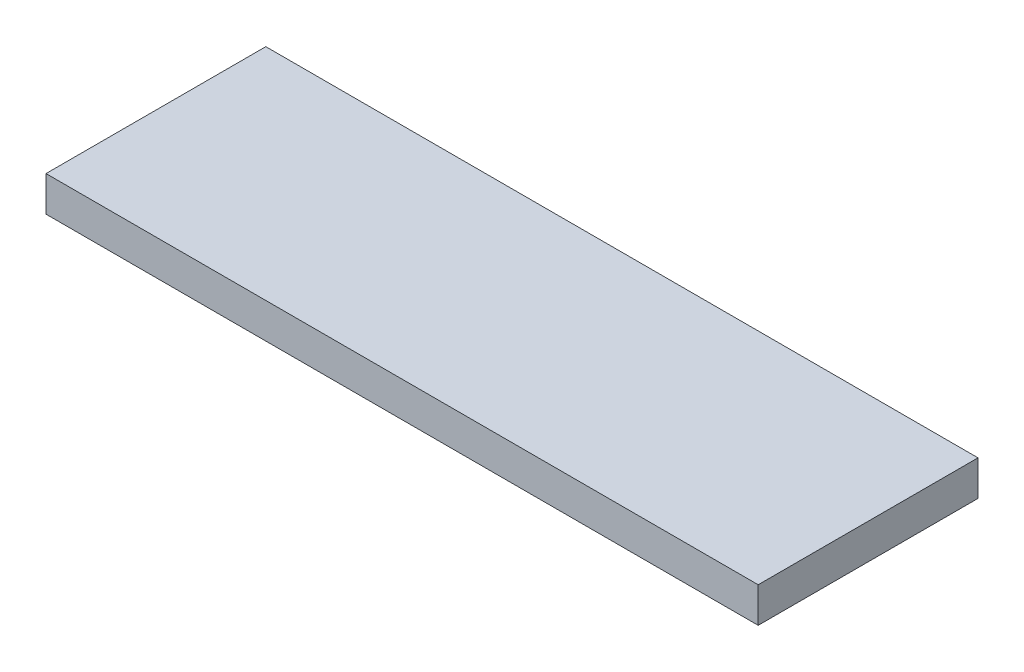
ISO-10303-21;
HEADER;
FILE_DESCRIPTION(('STEP AP214'),'2;1');
FILE_NAME('part.step','',(''),(''),'','','');
FILE_SCHEMA(('AUTOMOTIVE_DESIGN { 1 0 10303 214 1 1 1 1 }'));
ENDSEC;
DATA;
#1=APPLICATION_CONTEXT('core data for automotive mechanical design processes');
#2=APPLICATION_PROTOCOL_DEFINITION('international standard','automotive_design',2000,#1);
#3=PRODUCT_CONTEXT('',#1,'mechanical');
#4=PRODUCT('Part','Part','',(#3));
#5=PRODUCT_RELATED_PRODUCT_CATEGORY('part','',(#4));
#6=PRODUCT_DEFINITION_FORMATION('','',#4);
#7=PRODUCT_DEFINITION_CONTEXT('part definition',#1,'design');
#8=PRODUCT_DEFINITION('design','',#6,#7);
#9=PRODUCT_DEFINITION_SHAPE('','',#8);
#10=(LENGTH_UNIT() NAMED_UNIT(*) SI_UNIT(.MILLI.,.METRE.));
#11=(NAMED_UNIT(*) PLANE_ANGLE_UNIT() SI_UNIT($,.RADIAN.));
#12=(NAMED_UNIT(*) SI_UNIT($,.STERADIAN.) SOLID_ANGLE_UNIT());
#13=UNCERTAINTY_MEASURE_WITH_UNIT(LENGTH_MEASURE(1.E-05),#10,'distance_accuracy_value','');
#14=(GEOMETRIC_REPRESENTATION_CONTEXT(3) GLOBAL_UNCERTAINTY_ASSIGNED_CONTEXT((#13)) GLOBAL_UNIT_ASSIGNED_CONTEXT((#10,
#11,#12)) REPRESENTATION_CONTEXT('',''));
#15=CARTESIAN_POINT('',(0.,0.,0.));
#16=DIRECTION('',(0.,0.,1.));
#17=DIRECTION('',(1.,0.,0.));
#18=AXIS2_PLACEMENT_3D('',#15,#16,#17);
#19=CARTESIAN_POINT('',(0.,4.,25.));
#20=DIRECTION('',(1.,0.,0.));
#21=DIRECTION('',(0.,0.,-1.));
#22=AXIS2_PLACEMENT_3D('',#19,#20,#21);
#23=PLANE('',#22);
#24=DIRECTION('',(0.,-1.,0.));
#25=VECTOR('',#24,1.);
#26=CARTESIAN_POINT('',(0.,4.,0.));
#27=LINE('',#26,#25);
#28=CARTESIAN_POINT('',(0.,4.,0.));
#29=VERTEX_POINT('',#28);
#30=CARTESIAN_POINT('',(0.,0.,0.));
#31=VERTEX_POINT('',#30);
#32=EDGE_CURVE('E102',#29,#31,#27,.T.);
#33=ORIENTED_EDGE('',*,*,#32,.T.);
#34=DIRECTION('',(0.,0.,-1.));
#35=VECTOR('',#34,1.);
#36=CARTESIAN_POINT('',(0.,0.,25.));
#37=LINE('',#36,#35);
#38=CARTESIAN_POINT('',(0.,0.,25.));
#39=VERTEX_POINT('',#38);
#40=EDGE_CURVE('E11',#39,#31,#37,.T.);
#41=ORIENTED_EDGE('',*,*,#40,.F.);
#42=DIRECTION('',(0.,-1.,0.));
#43=VECTOR('',#42,1.);
#44=CARTESIAN_POINT('',(0.,4.,25.));
#45=LINE('',#44,#43);
#46=CARTESIAN_POINT('',(0.,4.,25.));
#47=VERTEX_POINT('',#46);
#48=EDGE_CURVE('E90',#47,#39,#45,.T.);
#49=ORIENTED_EDGE('',*,*,#48,.F.);
#50=DIRECTION('',(0.,0.,-1.));
#51=VECTOR('',#50,1.);
#52=CARTESIAN_POINT('',(0.,4.,25.));
#53=LINE('',#52,#51);
#54=EDGE_CURVE('E98',#47,#29,#53,.T.);
#55=ORIENTED_EDGE('',*,*,#54,.T.);
#56=EDGE_LOOP('',(#33,#41,#49,#55));
#57=FACE_BOUND('',#56,.T.);
#58=ADVANCED_FACE('F39',(#57),#23,.F.);
#59=CARTESIAN_POINT('',(0.,0.,25.));
#60=DIRECTION('',(0.,1.,0.));
#61=DIRECTION('',(0.,0.,1.));
#62=AXIS2_PLACEMENT_3D('',#59,#60,#61);
#63=PLANE('',#62);
#64=DIRECTION('',(1.,0.,0.));
#65=VECTOR('',#64,1.);
#66=CARTESIAN_POINT('',(0.,0.,0.));
#67=LINE('',#66,#65);
#68=CARTESIAN_POINT('',(81.,0.,0.));
#69=VERTEX_POINT('',#68);
#70=EDGE_CURVE('E94',#31,#69,#67,.T.);
#71=ORIENTED_EDGE('',*,*,#70,.T.);
#72=DIRECTION('',(0.,0.,-1.));
#73=VECTOR('',#72,1.);
#74=CARTESIAN_POINT('',(81.,0.,25.));
#75=LINE('',#74,#73);
#76=CARTESIAN_POINT('',(81.,0.,25.));
#77=VERTEX_POINT('',#76);
#78=EDGE_CURVE('E47',#77,#69,#75,.T.);
#79=ORIENTED_EDGE('',*,*,#78,.F.);
#80=DIRECTION('',(1.,0.,0.));
#81=VECTOR('',#80,1.);
#82=CARTESIAN_POINT('',(0.,0.,25.));
#83=LINE('',#82,#81);
#84=EDGE_CURVE('E85',#39,#77,#83,.T.);
#85=ORIENTED_EDGE('',*,*,#84,.F.);
#86=ORIENTED_EDGE('',*,*,#40,.T.);
#87=EDGE_LOOP('',(#71,#79,#85,#86));
#88=FACE_BOUND('',#87,.T.);
#89=ADVANCED_FACE('F93',(#88),#63,.F.);
#90=CARTESIAN_POINT('',(81.,0.,25.));
#91=DIRECTION('',(-1.,0.,0.));
#92=DIRECTION('',(0.,0.,1.));
#93=AXIS2_PLACEMENT_3D('',#90,#91,#92);
#94=PLANE('',#93);
#95=DIRECTION('',(0.,1.,0.));
#96=VECTOR('',#95,1.);
#97=CARTESIAN_POINT('',(81.,0.,0.));
#98=LINE('',#97,#96);
#99=CARTESIAN_POINT('',(81.,4.,0.));
#100=VERTEX_POINT('',#99);
#101=EDGE_CURVE('E72',#69,#100,#98,.T.);
#102=ORIENTED_EDGE('',*,*,#101,.T.);
#103=DIRECTION('',(0.,0.,-1.));
#104=VECTOR('',#103,1.);
#105=CARTESIAN_POINT('',(81.,4.,25.));
#106=LINE('',#105,#104);
#107=CARTESIAN_POINT('',(81.,4.,25.));
#108=VERTEX_POINT('',#107);
#109=EDGE_CURVE('E95',#108,#100,#106,.T.);
#110=ORIENTED_EDGE('',*,*,#109,.F.);
#111=DIRECTION('',(0.,1.,0.));
#112=VECTOR('',#111,1.);
#113=CARTESIAN_POINT('',(81.,0.,25.));
#114=LINE('',#113,#112);
#115=EDGE_CURVE('E88',#77,#108,#114,.T.);
#116=ORIENTED_EDGE('',*,*,#115,.F.);
#117=ORIENTED_EDGE('',*,*,#78,.T.);
#118=EDGE_LOOP('',(#102,#110,#116,#117));
#119=FACE_BOUND('',#118,.T.);
#120=ADVANCED_FACE('F96',(#119),#94,.F.);
#121=CARTESIAN_POINT('',(81.,4.,25.));
#122=DIRECTION('',(0.,-1.,0.));
#123=DIRECTION('',(0.,0.,-1.));
#124=AXIS2_PLACEMENT_3D('',#121,#122,#123);
#125=PLANE('',#124);
#126=DIRECTION('',(-1.,0.,0.));
#127=VECTOR('',#126,1.);
#128=CARTESIAN_POINT('',(81.,4.,0.));
#129=LINE('',#128,#127);
#130=EDGE_CURVE('E78',#100,#29,#129,.T.);
#131=ORIENTED_EDGE('',*,*,#130,.T.);
#132=ORIENTED_EDGE('',*,*,#54,.F.);
#133=DIRECTION('',(-1.,0.,0.));
#134=VECTOR('',#133,1.);
#135=CARTESIAN_POINT('',(81.,4.,25.));
#136=LINE('',#135,#134);
#137=EDGE_CURVE('E55',#108,#47,#136,.T.);
#138=ORIENTED_EDGE('',*,*,#137,.F.);
#139=ORIENTED_EDGE('',*,*,#109,.T.);
#140=EDGE_LOOP('',(#131,#132,#138,#139));
#141=FACE_BOUND('',#140,.T.);
#142=ADVANCED_FACE('F109',(#141),#125,.F.);
#143=CARTESIAN_POINT('',(0.,0.,25.));
#144=DIRECTION('',(0.,0.,1.));
#145=DIRECTION('',(1.,0.,0.));
#146=AXIS2_PLACEMENT_3D('',#143,#144,#145);
#147=PLANE('',#146);
#148=ORIENTED_EDGE('',*,*,#48,.T.);
#149=ORIENTED_EDGE('',*,*,#84,.T.);
#150=ORIENTED_EDGE('',*,*,#115,.T.);
#151=ORIENTED_EDGE('',*,*,#137,.T.);
#152=EDGE_LOOP('',(#148,#149,#150,#151));
#153=FACE_BOUND('',#152,.T.);
#154=ADVANCED_FACE('F86',(#153),#147,.T.);
#155=CARTESIAN_POINT('',(0.,0.,0.));
#156=DIRECTION('',(0.,0.,1.));
#157=DIRECTION('',(1.,0.,0.));
#158=AXIS2_PLACEMENT_3D('',#155,#156,#157);
#159=PLANE('',#158);
#160=ORIENTED_EDGE('',*,*,#32,.F.);
#161=ORIENTED_EDGE('',*,*,#130,.F.);
#162=ORIENTED_EDGE('',*,*,#101,.F.);
#163=ORIENTED_EDGE('',*,*,#70,.F.);
#164=EDGE_LOOP('',(#160,#161,#162,#163));
#165=FACE_BOUND('',#164,.T.);
#166=ADVANCED_FACE('F112',(#165),#159,.F.);
#167=CLOSED_SHELL('',(#58,#89,#120,#142,#154,#166));
#168=MANIFOLD_SOLID_BREP('B2',#167);
#169=ADVANCED_BREP_SHAPE_REPRESENTATION('',(#18,#168),#14);
#170=SHAPE_DEFINITION_REPRESENTATION(#9,#169);
ENDSEC;
END-ISO-10303-21;
